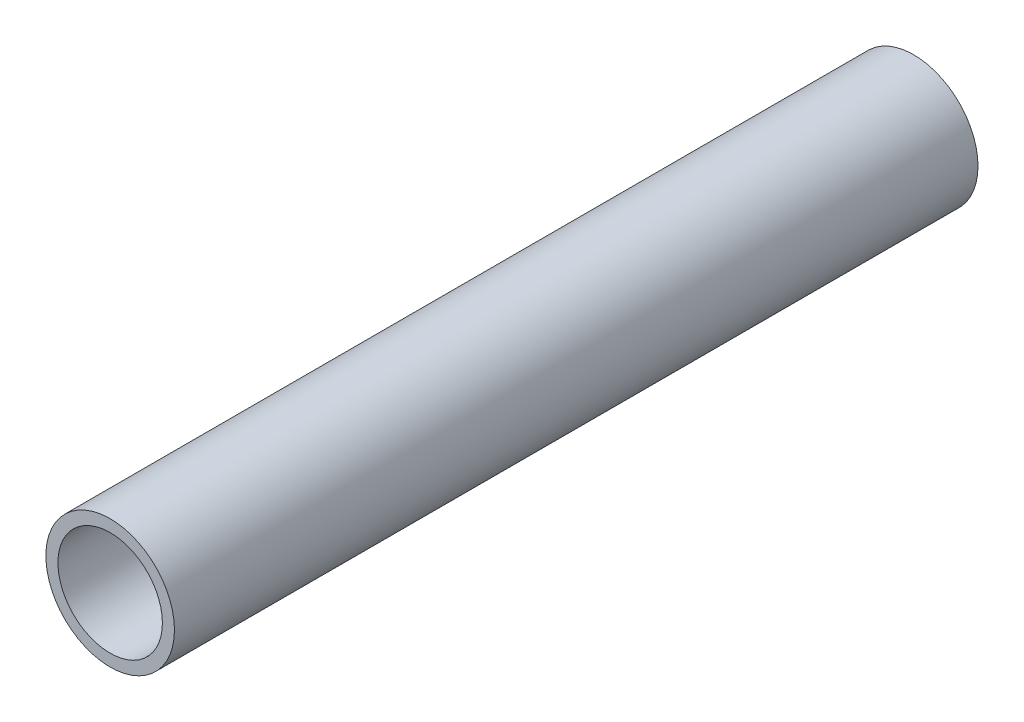
ISO-10303-21;
HEADER;
FILE_DESCRIPTION(('STEP AP214'),'2;1');
FILE_NAME('part.step','',(''),(''),'','','');
FILE_SCHEMA(('AUTOMOTIVE_DESIGN { 1 0 10303 214 1 1 1 1 }'));
ENDSEC;
DATA;
#1=APPLICATION_CONTEXT('core data for automotive mechanical design processes');
#2=APPLICATION_PROTOCOL_DEFINITION('international standard','automotive_design',2000,#1);
#3=PRODUCT_CONTEXT('',#1,'mechanical');
#4=PRODUCT('Part','Part','',(#3));
#5=PRODUCT_RELATED_PRODUCT_CATEGORY('part','',(#4));
#6=PRODUCT_DEFINITION_FORMATION('','',#4);
#7=PRODUCT_DEFINITION_CONTEXT('part definition',#1,'design');
#8=PRODUCT_DEFINITION('design','',#6,#7);
#9=PRODUCT_DEFINITION_SHAPE('','',#8);
#10=(LENGTH_UNIT() NAMED_UNIT(*) SI_UNIT(.MILLI.,.METRE.));
#11=(NAMED_UNIT(*) PLANE_ANGLE_UNIT() SI_UNIT($,.RADIAN.));
#12=(NAMED_UNIT(*) SI_UNIT($,.STERADIAN.) SOLID_ANGLE_UNIT());
#13=UNCERTAINTY_MEASURE_WITH_UNIT(LENGTH_MEASURE(1.E-05),#10,'distance_accuracy_value','');
#14=(GEOMETRIC_REPRESENTATION_CONTEXT(3) GLOBAL_UNCERTAINTY_ASSIGNED_CONTEXT((#13)) GLOBAL_UNIT_ASSIGNED_CONTEXT((#10,
#11,#12)) REPRESENTATION_CONTEXT('',''));
#15=CARTESIAN_POINT('',(0.,0.,0.));
#16=DIRECTION('',(0.,0.,1.));
#17=DIRECTION('',(1.,0.,0.));
#18=AXIS2_PLACEMENT_3D('',#15,#16,#17);
#19=CARTESIAN_POINT('',(0.,0.,80.));
#20=DIRECTION('',(0.,0.,1.));
#21=DIRECTION('',(1.,0.,0.));
#22=AXIS2_PLACEMENT_3D('',#19,#20,#21);
#23=PLANE('',#22);
#24=CARTESIAN_POINT('',(0.,0.,80.));
#25=DIRECTION('',(0.,0.,1.));
#26=DIRECTION('',(1.,0.,0.));
#27=AXIS2_PLACEMENT_3D('',#24,#25,#26);
#28=CIRCLE('',#27,6.4);
#29=CARTESIAN_POINT('',(6.4,0.,80.));
#30=VERTEX_POINT('',#29);
#31=EDGE_CURVE('E10',#30,#30,#28,.T.);
#32=ORIENTED_EDGE('',*,*,#31,.T.);
#33=EDGE_LOOP('',(#32));
#34=FACE_BOUND('',#33,.T.);
#35=CARTESIAN_POINT('',(0.,0.,80.));
#36=DIRECTION('',(0.,0.,1.));
#37=DIRECTION('',(1.,0.,0.));
#38=AXIS2_PLACEMENT_3D('',#35,#36,#37);
#39=CIRCLE('',#38,5.2);
#40=CARTESIAN_POINT('',(5.2,0.,80.));
#41=VERTEX_POINT('',#40);
#42=EDGE_CURVE('E58',#41,#41,#39,.T.);
#43=ORIENTED_EDGE('',*,*,#42,.F.);
#44=EDGE_LOOP('',(#43));
#45=FACE_BOUND('',#44,.T.);
#46=ADVANCED_FACE('F45',(#34,#45),#23,.T.);
#47=CARTESIAN_POINT('',(0.,0.,0.));
#48=DIRECTION('',(0.,0.,1.));
#49=DIRECTION('',(1.,0.,0.));
#50=AXIS2_PLACEMENT_3D('',#47,#48,#49);
#51=PLANE('',#50);
#52=CARTESIAN_POINT('',(0.,0.,0.));
#53=DIRECTION('',(0.,0.,1.));
#54=DIRECTION('',(1.,0.,0.));
#55=AXIS2_PLACEMENT_3D('',#52,#53,#54);
#56=CIRCLE('',#55,6.4);
#57=CARTESIAN_POINT('',(6.4,0.,0.));
#58=VERTEX_POINT('',#57);
#59=EDGE_CURVE('E49',#58,#58,#56,.T.);
#60=ORIENTED_EDGE('',*,*,#59,.F.);
#61=EDGE_LOOP('',(#60));
#62=FACE_BOUND('',#61,.T.);
#63=CARTESIAN_POINT('',(0.,0.,0.));
#64=DIRECTION('',(0.,0.,1.));
#65=DIRECTION('',(1.,0.,0.));
#66=AXIS2_PLACEMENT_3D('',#63,#64,#65);
#67=CIRCLE('',#66,5.2);
#68=CARTESIAN_POINT('',(5.2,0.,0.));
#69=VERTEX_POINT('',#68);
#70=EDGE_CURVE('E60',#69,#69,#67,.T.);
#71=ORIENTED_EDGE('',*,*,#70,.T.);
#72=EDGE_LOOP('',(#71));
#73=FACE_BOUND('',#72,.T.);
#74=ADVANCED_FACE('F72',(#62,#73),#51,.F.);
#75=CARTESIAN_POINT('',(0.,0.,80.));
#76=DIRECTION('',(0.,0.,-1.));
#77=DIRECTION('',(-1.,0.,0.));
#78=AXIS2_PLACEMENT_3D('',#75,#76,#77);
#79=CYLINDRICAL_SURFACE('',#78,6.4);
#80=ORIENTED_EDGE('',*,*,#31,.F.);
#81=EDGE_LOOP('',(#80));
#82=FACE_BOUND('',#81,.T.);
#83=ORIENTED_EDGE('',*,*,#59,.T.);
#84=EDGE_LOOP('',(#83));
#85=FACE_BOUND('',#84,.T.);
#86=ADVANCED_FACE('F47',(#82,#85),#79,.T.);
#87=CARTESIAN_POINT('',(0.,0.,80.));
#88=DIRECTION('',(0.,0.,-1.));
#89=DIRECTION('',(-1.,0.,0.));
#90=AXIS2_PLACEMENT_3D('',#87,#88,#89);
#91=CYLINDRICAL_SURFACE('',#90,5.2);
#92=ORIENTED_EDGE('',*,*,#42,.T.);
#93=EDGE_LOOP('',(#92));
#94=FACE_BOUND('',#93,.T.);
#95=ORIENTED_EDGE('',*,*,#70,.F.);
#96=EDGE_LOOP('',(#95));
#97=FACE_BOUND('',#96,.T.);
#98=ADVANCED_FACE('F68',(#94,#97),#91,.F.);
#99=CLOSED_SHELL('',(#46,#74,#86,#98));
#100=MANIFOLD_SOLID_BREP('B2',#99);
#101=ADVANCED_BREP_SHAPE_REPRESENTATION('',(#18,#100),#14);
#102=SHAPE_DEFINITION_REPRESENTATION(#9,#101);
ENDSEC;
END-ISO-10303-21;
